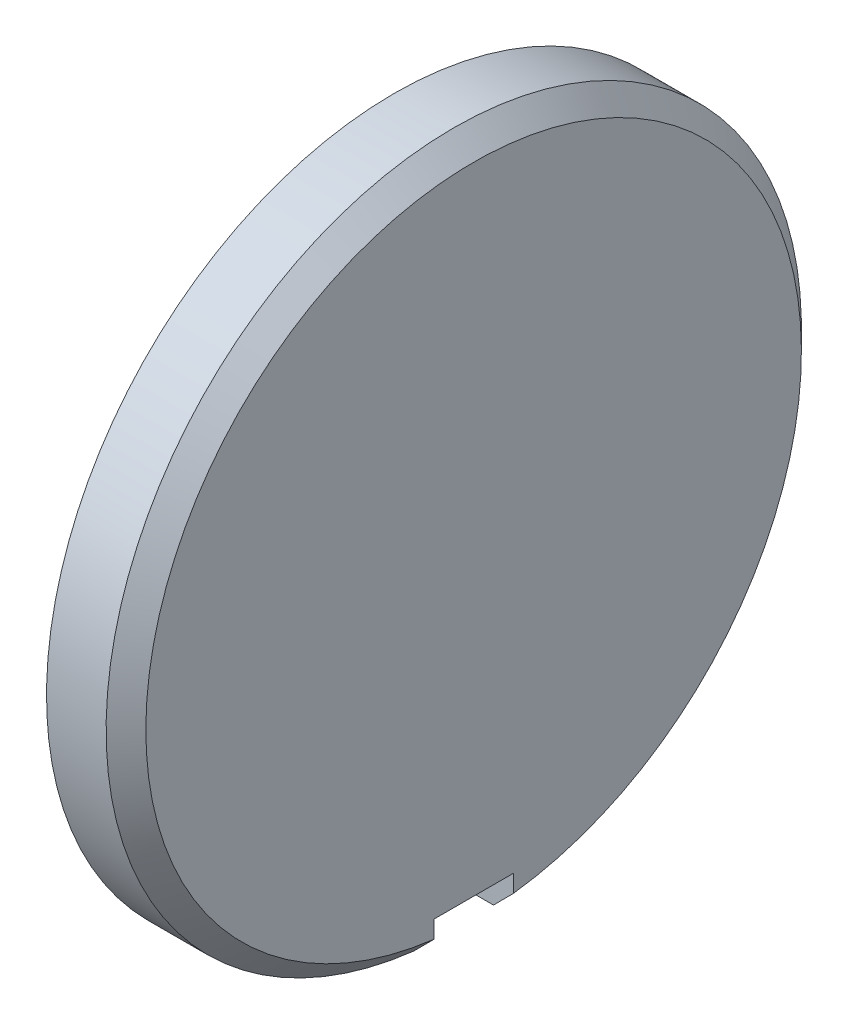
ISO-10303-21;
HEADER;
FILE_DESCRIPTION(('STEP AP214'),'2;1');
FILE_NAME('part.step','',(''),(''),'','','');
FILE_SCHEMA(('AUTOMOTIVE_DESIGN { 1 0 10303 214 1 1 1 1 }'));
ENDSEC;
DATA;
#1=APPLICATION_CONTEXT('core data for automotive mechanical design processes');
#2=APPLICATION_PROTOCOL_DEFINITION('international standard','automotive_design',2000,#1);
#3=PRODUCT_CONTEXT('',#1,'mechanical');
#4=PRODUCT('Part','Part','',(#3));
#5=PRODUCT_RELATED_PRODUCT_CATEGORY('part','',(#4));
#6=PRODUCT_DEFINITION_FORMATION('','',#4);
#7=PRODUCT_DEFINITION_CONTEXT('part definition',#1,'design');
#8=PRODUCT_DEFINITION('design','',#6,#7);
#9=PRODUCT_DEFINITION_SHAPE('','',#8);
#10=(LENGTH_UNIT() NAMED_UNIT(*) SI_UNIT(.MILLI.,.METRE.));
#11=(NAMED_UNIT(*) PLANE_ANGLE_UNIT() SI_UNIT($,.RADIAN.));
#12=(NAMED_UNIT(*) SI_UNIT($,.STERADIAN.) SOLID_ANGLE_UNIT());
#13=UNCERTAINTY_MEASURE_WITH_UNIT(LENGTH_MEASURE(1.E-05),#10,'distance_accuracy_value','');
#14=(GEOMETRIC_REPRESENTATION_CONTEXT(3) GLOBAL_UNCERTAINTY_ASSIGNED_CONTEXT((#13)) GLOBAL_UNIT_ASSIGNED_CONTEXT((#10,
#11,#12)) REPRESENTATION_CONTEXT('',''));
#15=CARTESIAN_POINT('',(0.,0.,0.));
#16=DIRECTION('',(0.,0.,1.));
#17=DIRECTION('',(1.,0.,0.));
#18=AXIS2_PLACEMENT_3D('',#15,#16,#17);
#19=CARTESIAN_POINT('',(85.6,-65.,66.));
#20=DIRECTION('',(-1.,0.,0.));
#21=DIRECTION('',(0.,0.,1.));
#22=AXIS2_PLACEMENT_3D('',#19,#20,#21);
#23=PLANE('',#22);
#24=DIRECTION('',(0.,-1.,0.));
#25=VECTOR('',#24,1.);
#26=CARTESIAN_POINT('',(85.6,-65.,66.8));
#27=LINE('',#26,#25);
#28=CARTESIAN_POINT('',(85.6,-71.2,66.8));
#29=VERTEX_POINT('',#28);
#30=CARTESIAN_POINT('',(85.6,-71.5513357416637,66.8));
#31=VERTEX_POINT('',#30);
#32=EDGE_CURVE('E210',#29,#31,#27,.T.);
#33=ORIENTED_EDGE('',*,*,#32,.F.);
#34=DIRECTION('',(0.,0.,1.));
#35=VECTOR('',#34,1.);
#36=CARTESIAN_POINT('',(85.6,-71.2,66.));
#37=LINE('',#36,#35);
#38=CARTESIAN_POINT('',(85.6,-71.2,65.2));
#39=VERTEX_POINT('',#38);
#40=EDGE_CURVE('E202',#39,#29,#37,.T.);
#41=ORIENTED_EDGE('',*,*,#40,.F.);
#42=DIRECTION('',(0.,-1.,0.));
#43=VECTOR('',#42,1.);
#44=CARTESIAN_POINT('',(85.6,-65.,65.2));
#45=LINE('',#44,#43);
#46=CARTESIAN_POINT('',(85.6,-71.5513357416637,65.2));
#47=VERTEX_POINT('',#46);
#48=EDGE_CURVE('E188',#39,#47,#45,.T.);
#49=ORIENTED_EDGE('',*,*,#48,.T.);
#50=CARTESIAN_POINT('',(85.6,-65.,66.));
#51=DIRECTION('',(-1.,0.,0.));
#52=DIRECTION('',(0.,0.,1.));
#53=AXIS2_PLACEMENT_3D('',#50,#51,#52);
#54=CIRCLE('',#53,6.6);
#55=EDGE_CURVE('E315',#31,#47,#54,.T.);
#56=ORIENTED_EDGE('',*,*,#55,.F.);
#57=EDGE_LOOP('',(#33,#41,#49,#56));
#58=FACE_BOUND('',#57,.T.);
#59=ADVANCED_FACE('F47',(#58),#23,.F.);
#60=CARTESIAN_POINT('',(85.6,-65.,66.));
#61=DIRECTION('',(-1.,0.,0.));
#62=DIRECTION('',(0.,0.,1.));
#63=AXIS2_PLACEMENT_3D('',#60,#61,#62);
#64=CONICAL_SURFACE('',#63,6.6,0.785398163397466);
#65=CARTESIAN_POINT('',(86.4946271909999,-70.6490068941078,66.8));
#66=CARTESIAN_POINT('',(86.3124416781385,-70.8330057927748,66.8));
#67=CARTESIAN_POINT('',(86.1301724326838,-71.0169217300399,66.8));
#68=CARTESIAN_POINT('',(85.7654990840124,-71.3846197394094,66.8));
#69=CARTESIAN_POINT('',(85.5830949808418,-71.5684018115597,66.8));
#70=CARTESIAN_POINT('',(85.2181844268204,-71.9358642466467,66.8));
#71=CARTESIAN_POINT('',(85.0356779759848,-72.1195446095986,66.8));
#72=CARTESIAN_POINT('',(84.6705824210977,-72.4868233002689,66.8));
#73=CARTESIAN_POINT('',(84.4879933170182,-72.6704216279594,66.8));
#74=CARTESIAN_POINT('',(84.3053728090001,-72.8539886990545,66.8));
#75=B_SPLINE_CURVE_WITH_KNOTS('',3,(#65,#66,#67,#68,#69,#70,#71,#72,#73,#74),.UNSPECIFIED.,.F.,
.F.,(4,2,2,2,4),(0.,0.776803884748463,1.55360750407648,2.33041100759796,3.10721477439803),.UNSPECIFIED.);
#76=CARTESIAN_POINT('',(85.2,-71.9541354602855,66.8));
#77=VERTEX_POINT('',#76);
#78=EDGE_CURVE('E217',#31,#77,#75,.T.);
#79=ORIENTED_EDGE('',*,*,#78,.F.);
#80=ORIENTED_EDGE('',*,*,#55,.T.);
#81=CARTESIAN_POINT('',(86.4946271909999,-70.6490068941078,65.2));
#82=CARTESIAN_POINT('',(86.3124416781385,-70.8330057927748,65.2));
#83=CARTESIAN_POINT('',(86.1301724326838,-71.0169217300399,65.2));
#84=CARTESIAN_POINT('',(85.7654990840124,-71.3846197394094,65.2));
#85=CARTESIAN_POINT('',(85.5830949808418,-71.5684018115597,65.2));
#86=CARTESIAN_POINT('',(85.2181844268204,-71.9358642466467,65.2));
#87=CARTESIAN_POINT('',(85.0356779759848,-72.1195446095986,65.2));
#88=CARTESIAN_POINT('',(84.6705824210977,-72.4868233002689,65.2));
#89=CARTESIAN_POINT('',(84.4879933170182,-72.6704216279594,65.2));
#90=CARTESIAN_POINT('',(84.3053728090001,-72.8539886990545,65.2));
#91=B_SPLINE_CURVE_WITH_KNOTS('',3,(#81,#82,#83,#84,#85,#86,#87,#88,#89,#90),.UNSPECIFIED.,.F.,
.F.,(4,2,2,2,4),(0.,0.776803884748463,1.55360750407648,2.33041100759796,3.10721477439803),.UNSPECIFIED.);
#92=CARTESIAN_POINT('',(85.2,-71.9541354602855,65.2));
#93=VERTEX_POINT('',#92);
#94=EDGE_CURVE('E191',#47,#93,#91,.T.);
#95=ORIENTED_EDGE('',*,*,#94,.T.);
#96=CARTESIAN_POINT('',(85.2,-65.,66.));
#97=DIRECTION('',(-1.,0.,0.));
#98=DIRECTION('',(0.,0.,1.));
#99=AXIS2_PLACEMENT_3D('',#96,#97,#98);
#100=CIRCLE('',#99,7.);
#101=EDGE_CURVE('E311',#77,#93,#100,.T.);
#102=ORIENTED_EDGE('',*,*,#101,.F.);
#103=EDGE_LOOP('',(#79,#80,#95,#102));
#104=FACE_BOUND('',#103,.T.);
#105=ADVANCED_FACE('F470',(#104),#64,.T.);
#106=CARTESIAN_POINT('',(77.8,-65.,66.));
#107=DIRECTION('',(-1.,0.,0.));
#108=DIRECTION('',(0.,0.,1.));
#109=AXIS2_PLACEMENT_3D('',#106,#107,#108);
#110=CYLINDRICAL_SURFACE('',#109,7.);
#111=DIRECTION('',(-1.,0.,0.));
#112=VECTOR('',#111,1.);
#113=CARTESIAN_POINT('',(77.8,-71.9541354602855,66.8));
#114=LINE('',#113,#112);
#115=CARTESIAN_POINT('',(84.,-71.9541354602855,66.8));
#116=VERTEX_POINT('',#115);
#117=EDGE_CURVE('E197',#77,#116,#114,.T.);
#118=ORIENTED_EDGE('',*,*,#117,.F.);
#119=ORIENTED_EDGE('',*,*,#101,.T.);
#120=DIRECTION('',(-1.,0.,0.));
#121=VECTOR('',#120,1.);
#122=CARTESIAN_POINT('',(77.8,-71.9541354602855,65.2));
#123=LINE('',#122,#121);
#124=CARTESIAN_POINT('',(84.,-71.9541354602855,65.2));
#125=VERTEX_POINT('',#124);
#126=EDGE_CURVE('E679',#93,#125,#123,.T.);
#127=ORIENTED_EDGE('',*,*,#126,.T.);
#128=CARTESIAN_POINT('',(84.,-65.,66.));
#129=DIRECTION('',(-1.,0.,0.));
#130=DIRECTION('',(0.,0.,1.));
#131=AXIS2_PLACEMENT_3D('',#128,#129,#130);
#132=CIRCLE('',#131,7.);
#133=EDGE_CURVE('E307',#116,#125,#132,.T.);
#134=ORIENTED_EDGE('',*,*,#133,.F.);
#135=EDGE_LOOP('',(#118,#119,#127,#134));
#136=FACE_BOUND('',#135,.T.);
#137=ADVANCED_FACE('F475',(#136),#110,.T.);
#138=CARTESIAN_POINT('',(84.,-58.,66.));
#139=DIRECTION('',(1.,0.,0.));
#140=DIRECTION('',(0.,0.,-1.));
#141=AXIS2_PLACEMENT_3D('',#138,#139,#140);
#142=PLANE('',#141);
#143=CARTESIAN_POINT('',(84.,-65.,66.));
#144=DIRECTION('',(-1.,0.,0.));
#145=DIRECTION('',(0.,0.,1.));
#146=AXIS2_PLACEMENT_3D('',#143,#144,#145);
#147=CIRCLE('',#146,3.);
#148=CARTESIAN_POINT('',(84.,-65.,69.));
#149=VERTEX_POINT('',#148);
#150=EDGE_CURVE('E301',#149,#149,#147,.T.);
#151=ORIENTED_EDGE('',*,*,#150,.F.);
#152=EDGE_LOOP('',(#151));
#153=FACE_BOUND('',#152,.T.);
#154=DIRECTION('',(0.,1.,0.));
#155=VECTOR('',#154,1.);
#156=CARTESIAN_POINT('',(84.,-58.,66.8));
#157=LINE('',#156,#155);
#158=CARTESIAN_POINT('',(84.,-71.2,66.8));
#159=VERTEX_POINT('',#158);
#160=EDGE_CURVE('E11',#116,#159,#157,.T.);
#161=ORIENTED_EDGE('',*,*,#160,.F.);
#162=ORIENTED_EDGE('',*,*,#133,.T.);
#163=DIRECTION('',(0.,1.,0.));
#164=VECTOR('',#163,1.);
#165=CARTESIAN_POINT('',(84.,-58.,65.2));
#166=LINE('',#165,#164);
#167=CARTESIAN_POINT('',(84.,-71.2,65.2));
#168=VERTEX_POINT('',#167);
#169=EDGE_CURVE('E363',#125,#168,#166,.T.);
#170=ORIENTED_EDGE('',*,*,#169,.T.);
#171=DIRECTION('',(0.,0.,-1.));
#172=VECTOR('',#171,1.);
#173=CARTESIAN_POINT('',(84.,-71.2,66.));
#174=LINE('',#173,#172);
#175=EDGE_CURVE('E56',#159,#168,#174,.T.);
#176=ORIENTED_EDGE('',*,*,#175,.F.);
#177=EDGE_LOOP('',(#161,#162,#170,#176));
#178=FACE_BOUND('',#177,.T.);
#179=ADVANCED_FACE('F498',(#153,#178),#142,.F.);
#180=CARTESIAN_POINT('',(82.8,-62.,66.));
#181=DIRECTION('',(1.,0.,0.));
#182=DIRECTION('',(0.,0.,-1.));
#183=AXIS2_PLACEMENT_3D('',#180,#181,#182);
#184=PLANE('',#183);
#185=DIRECTION('',(0.,1.,0.));
#186=VECTOR('',#185,1.);
#187=CARTESIAN_POINT('',(82.8,-62.,66.4));
#188=LINE('',#187,#186);
#189=CARTESIAN_POINT('',(82.8,-67.9732137494637,66.4));
#190=VERTEX_POINT('',#189);
#191=CARTESIAN_POINT('',(82.8,-67.2649503305812,66.4));
#192=VERTEX_POINT('',#191);
#193=EDGE_CURVE('E248',#190,#192,#188,.T.);
#194=ORIENTED_EDGE('',*,*,#193,.F.);
#195=CARTESIAN_POINT('',(82.8,-65.,66.));
#196=DIRECTION('',(-1.,0.,0.));
#197=DIRECTION('',(0.,0.,1.));
#198=AXIS2_PLACEMENT_3D('',#195,#196,#197);
#199=CIRCLE('',#198,3.);
#200=CARTESIAN_POINT('',(82.8,-65.4,68.9732137494637));
#201=VERTEX_POINT('',#200);
#202=EDGE_CURVE('E296',#190,#201,#199,.T.);
#203=ORIENTED_EDGE('',*,*,#202,.T.);
#204=DIRECTION('',(0.,0.,1.));
#205=VECTOR('',#204,1.);
#206=CARTESIAN_POINT('',(82.8,-65.4,66.));
#207=LINE('',#206,#205);
#208=CARTESIAN_POINT('',(82.8,-65.4,68.2649503305812));
#209=VERTEX_POINT('',#208);
#210=EDGE_CURVE('E284',#209,#201,#207,.T.);
#211=ORIENTED_EDGE('',*,*,#210,.F.);
#212=CARTESIAN_POINT('',(82.8,-65.,66.));
#213=DIRECTION('',(-1.,0.,0.));
#214=DIRECTION('',(0.,0.,1.));
#215=AXIS2_PLACEMENT_3D('',#212,#213,#214);
#216=CIRCLE('',#215,2.3);
#217=EDGE_CURVE('E322',#192,#209,#216,.T.);
#218=ORIENTED_EDGE('',*,*,#217,.F.);
#219=EDGE_LOOP('',(#194,#203,#211,#218));
#220=FACE_BOUND('',#219,.T.);
#221=ADVANCED_FACE('F418',(#220),#184,.F.);
#222=DIRECTION('',(0.,1.,0.));
#223=VECTOR('',#222,1.);
#224=CARTESIAN_POINT('',(82.8,-62.,66.4));
#225=LINE('',#224,#223);
#226=CARTESIAN_POINT('',(82.8,-62.7350496694188,66.4));
#227=VERTEX_POINT('',#226);
#228=CARTESIAN_POINT('',(82.8,-62.0267862505363,66.4));
#229=VERTEX_POINT('',#228);
#230=EDGE_CURVE('E242',#227,#229,#225,.T.);
#231=ORIENTED_EDGE('',*,*,#230,.F.);
#232=CARTESIAN_POINT('',(82.8,-64.6,68.2649503305812));
#233=VERTEX_POINT('',#232);
#234=EDGE_CURVE('E323',#233,#227,#216,.T.);
#235=ORIENTED_EDGE('',*,*,#234,.F.);
#236=DIRECTION('',(0.,0.,-1.));
#237=VECTOR('',#236,1.);
#238=CARTESIAN_POINT('',(82.8,-64.6,66.));
#239=LINE('',#238,#237);
#240=CARTESIAN_POINT('',(82.8,-64.6,68.9732137494637));
#241=VERTEX_POINT('',#240);
#242=EDGE_CURVE('E273',#241,#233,#239,.T.);
#243=ORIENTED_EDGE('',*,*,#242,.F.);
#244=EDGE_CURVE('E297',#241,#229,#199,.T.);
#245=ORIENTED_EDGE('',*,*,#244,.T.);
#246=EDGE_LOOP('',(#231,#235,#243,#245));
#247=FACE_BOUND('',#246,.T.);
#248=ADVANCED_FACE('F436',(#247),#184,.F.);
#249=CARTESIAN_POINT('',(77.8,-65.,66.));
#250=DIRECTION('',(-1.,0.,0.));
#251=DIRECTION('',(0.,0.,1.));
#252=AXIS2_PLACEMENT_3D('',#249,#250,#251);
#253=CYLINDRICAL_SURFACE('',#252,2.3);
#254=CARTESIAN_POINT('',(84.,-65.,66.));
#255=DIRECTION('',(-1.,0.,0.));
#256=DIRECTION('',(0.,0.,1.));
#257=AXIS2_PLACEMENT_3D('',#254,#255,#256);
#258=CIRCLE('',#257,2.3);
#259=CARTESIAN_POINT('',(84.,-65.,68.3));
#260=VERTEX_POINT('',#259);
#261=EDGE_CURVE('E318',#260,#260,#258,.T.);
#262=ORIENTED_EDGE('',*,*,#261,.F.);
#263=EDGE_LOOP('',(#262));
#264=FACE_BOUND('',#263,.T.);
#265=DIRECTION('',(-1.,0.,0.));
#266=VECTOR('',#265,1.);
#267=CARTESIAN_POINT('',(77.8,-67.2649503305812,66.4));
#268=LINE('',#267,#266);
#269=CARTESIAN_POINT('',(83.98,-67.2649503305812,66.4));
#270=VERTEX_POINT('',#269);
#271=EDGE_CURVE('E251',#192,#270,#268,.F.);
#272=ORIENTED_EDGE('',*,*,#271,.F.);
#273=ORIENTED_EDGE('',*,*,#217,.T.);
#274=DIRECTION('',(-1.,0.,0.));
#275=VECTOR('',#274,1.);
#276=CARTESIAN_POINT('',(77.8,-65.4,68.2649503305812));
#277=LINE('',#276,#275);
#278=CARTESIAN_POINT('',(83.98,-65.4,68.2649503305812));
#279=VERTEX_POINT('',#278);
#280=EDGE_CURVE('E288',#279,#209,#277,.T.);
#281=ORIENTED_EDGE('',*,*,#280,.F.);
#282=CARTESIAN_POINT('',(83.98,-65.,66.));
#283=DIRECTION('',(-1.,0.,0.));
#284=DIRECTION('',(0.,0.,1.));
#285=AXIS2_PLACEMENT_3D('',#282,#283,#284);
#286=CIRCLE('',#285,2.3);
#287=CARTESIAN_POINT('',(83.98,-64.6,68.2649503305812));
#288=VERTEX_POINT('',#287);
#289=EDGE_CURVE('E280',#288,#279,#286,.F.);
#290=ORIENTED_EDGE('',*,*,#289,.F.);
#291=DIRECTION('',(-1.,0.,0.));
#292=VECTOR('',#291,1.);
#293=CARTESIAN_POINT('',(77.8,-64.6,68.2649503305812));
#294=LINE('',#293,#292);
#295=EDGE_CURVE('E277',#233,#288,#294,.F.);
#296=ORIENTED_EDGE('',*,*,#295,.F.);
#297=ORIENTED_EDGE('',*,*,#234,.T.);
#298=DIRECTION('',(-1.,0.,0.));
#299=VECTOR('',#298,1.);
#300=CARTESIAN_POINT('',(77.8,-62.7350496694188,66.4));
#301=LINE('',#300,#299);
#302=CARTESIAN_POINT('',(83.98,-62.7350496694188,66.4));
#303=VERTEX_POINT('',#302);
#304=EDGE_CURVE('E245',#303,#227,#301,.T.);
#305=ORIENTED_EDGE('',*,*,#304,.F.);
#306=CARTESIAN_POINT('',(83.98,-65.,66.));
#307=DIRECTION('',(-1.,0.,0.));
#308=DIRECTION('',(0.,0.,1.));
#309=AXIS2_PLACEMENT_3D('',#306,#307,#308);
#310=CIRCLE('',#309,2.3);
#311=CARTESIAN_POINT('',(83.98,-62.7350496694188,65.6));
#312=VERTEX_POINT('',#311);
#313=EDGE_CURVE('E254',#312,#303,#310,.F.);
#314=ORIENTED_EDGE('',*,*,#313,.F.);
#315=DIRECTION('',(-1.,0.,0.));
#316=VECTOR('',#315,1.);
#317=CARTESIAN_POINT('',(77.8,-62.7350496694188,65.6));
#318=LINE('',#317,#316);
#319=CARTESIAN_POINT('',(82.8,-62.7350496694188,65.6));
#320=VERTEX_POINT('',#319);
#321=EDGE_CURVE('E230',#312,#320,#318,.T.);
#322=ORIENTED_EDGE('',*,*,#321,.T.);
#323=CARTESIAN_POINT('',(82.8,-64.6,63.7350496694188));
#324=VERTEX_POINT('',#323);
#325=EDGE_CURVE('E328',#320,#324,#216,.T.);
#326=ORIENTED_EDGE('',*,*,#325,.T.);
#327=DIRECTION('',(-1.,0.,0.));
#328=VECTOR('',#327,1.);
#329=CARTESIAN_POINT('',(77.8,-64.6,63.7350496694188));
#330=LINE('',#329,#328);
#331=CARTESIAN_POINT('',(83.98,-64.6,63.7350496694188));
#332=VERTEX_POINT('',#331);
#333=EDGE_CURVE('E272',#332,#324,#330,.T.);
#334=ORIENTED_EDGE('',*,*,#333,.F.);
#335=CARTESIAN_POINT('',(83.98,-65.4,63.7350496694188));
#336=VERTEX_POINT('',#335);
#337=EDGE_CURVE('E283',#336,#332,#286,.F.);
#338=ORIENTED_EDGE('',*,*,#337,.F.);
#339=DIRECTION('',(-1.,0.,0.));
#340=VECTOR('',#339,1.);
#341=CARTESIAN_POINT('',(77.8,-65.4,63.7350496694188));
#342=LINE('',#341,#340);
#343=CARTESIAN_POINT('',(82.8,-65.4,63.7350496694188));
#344=VERTEX_POINT('',#343);
#345=EDGE_CURVE('E293',#344,#336,#342,.F.);
#346=ORIENTED_EDGE('',*,*,#345,.F.);
#347=CARTESIAN_POINT('',(82.8,-67.2649503305812,65.6));
#348=VERTEX_POINT('',#347);
#349=EDGE_CURVE('E329',#344,#348,#216,.T.);
#350=ORIENTED_EDGE('',*,*,#349,.T.);
#351=DIRECTION('',(-1.,0.,0.));
#352=VECTOR('',#351,1.);
#353=CARTESIAN_POINT('',(77.8,-67.2649503305812,65.6));
#354=LINE('',#353,#352);
#355=CARTESIAN_POINT('',(83.98,-67.2649503305812,65.6));
#356=VERTEX_POINT('',#355);
#357=EDGE_CURVE('E238',#348,#356,#354,.F.);
#358=ORIENTED_EDGE('',*,*,#357,.T.);
#359=EDGE_CURVE('E257',#270,#356,#310,.F.);
#360=ORIENTED_EDGE('',*,*,#359,.F.);
#361=EDGE_LOOP('',(#272,#273,#281,#290,#296,#297,#305,#314,#322,#326,#334,#338,#346,#350,#358,#360));
#362=FACE_BOUND('',#361,.T.);
#363=ADVANCED_FACE('F397',(#264,#362),#253,.F.);
#364=CARTESIAN_POINT('',(77.8,-65.,66.));
#365=DIRECTION('',(-1.,0.,0.));
#366=DIRECTION('',(0.,0.,1.));
#367=AXIS2_PLACEMENT_3D('',#364,#365,#366);
#368=CYLINDRICAL_SURFACE('',#367,3.);
#369=ORIENTED_EDGE('',*,*,#150,.T.);
#370=EDGE_LOOP('',(#369));
#371=FACE_BOUND('',#370,.T.);
#372=DIRECTION('',(-1.,0.,0.));
#373=VECTOR('',#372,1.);
#374=CARTESIAN_POINT('',(77.8,-67.9732137494637,66.4));
#375=LINE('',#374,#373);
#376=CARTESIAN_POINT('',(83.98,-67.9732137494637,66.4));
#377=VERTEX_POINT('',#376);
#378=EDGE_CURVE('E360',#377,#190,#375,.T.);
#379=ORIENTED_EDGE('',*,*,#378,.F.);
#380=CARTESIAN_POINT('',(83.98,-65.,66.));
#381=DIRECTION('',(-1.,0.,0.));
#382=DIRECTION('',(0.,0.,1.));
#383=AXIS2_PLACEMENT_3D('',#380,#381,#382);
#384=CIRCLE('',#383,3.);
#385=CARTESIAN_POINT('',(83.98,-67.9732137494637,65.6));
#386=VERTEX_POINT('',#385);
#387=EDGE_CURVE('E353',#386,#377,#384,.T.);
#388=ORIENTED_EDGE('',*,*,#387,.F.);
#389=DIRECTION('',(-1.,0.,0.));
#390=VECTOR('',#389,1.);
#391=CARTESIAN_POINT('',(77.8,-67.9732137494637,65.6));
#392=LINE('',#391,#390);
#393=CARTESIAN_POINT('',(82.8,-67.9732137494637,65.6));
#394=VERTEX_POINT('',#393);
#395=EDGE_CURVE('E356',#386,#394,#392,.T.);
#396=ORIENTED_EDGE('',*,*,#395,.T.);
#397=CARTESIAN_POINT('',(82.8,-65.4,63.0267862505363));
#398=VERTEX_POINT('',#397);
#399=EDGE_CURVE('E303',#398,#394,#199,.T.);
#400=ORIENTED_EDGE('',*,*,#399,.F.);
#401=DIRECTION('',(-1.,0.,0.));
#402=VECTOR('',#401,1.);
#403=CARTESIAN_POINT('',(77.8,-65.4,63.0267862505363));
#404=LINE('',#403,#402);
#405=CARTESIAN_POINT('',(83.98,-65.4,63.0267862505363));
#406=VERTEX_POINT('',#405);
#407=EDGE_CURVE('E335',#406,#398,#404,.T.);
#408=ORIENTED_EDGE('',*,*,#407,.F.);
#409=CARTESIAN_POINT('',(83.98,-65.,66.));
#410=DIRECTION('',(-1.,0.,0.));
#411=DIRECTION('',(0.,0.,1.));
#412=AXIS2_PLACEMENT_3D('',#409,#410,#411);
#413=CIRCLE('',#412,3.);
#414=CARTESIAN_POINT('',(83.98,-64.6,63.0267862505363));
#415=VERTEX_POINT('',#414);
#416=EDGE_CURVE('E332',#415,#406,#413,.T.);
#417=ORIENTED_EDGE('',*,*,#416,.F.);
#418=DIRECTION('',(-1.,0.,0.));
#419=VECTOR('',#418,1.);
#420=CARTESIAN_POINT('',(77.8,-64.6,63.0267862505363));
#421=LINE('',#420,#419);
#422=CARTESIAN_POINT('',(82.8,-64.6,63.0267862505363));
#423=VERTEX_POINT('',#422);
#424=EDGE_CURVE('E327',#423,#415,#421,.F.);
#425=ORIENTED_EDGE('',*,*,#424,.F.);
#426=CARTESIAN_POINT('',(82.8,-62.0267862505363,65.6));
#427=VERTEX_POINT('',#426);
#428=EDGE_CURVE('E302',#427,#423,#199,.T.);
#429=ORIENTED_EDGE('',*,*,#428,.F.);
#430=DIRECTION('',(-1.,0.,0.));
#431=VECTOR('',#430,1.);
#432=CARTESIAN_POINT('',(77.8,-62.0267862505363,65.6));
#433=LINE('',#432,#431);
#434=CARTESIAN_POINT('',(83.98,-62.0267862505363,65.6));
#435=VERTEX_POINT('',#434);
#436=EDGE_CURVE('E345',#427,#435,#433,.F.);
#437=ORIENTED_EDGE('',*,*,#436,.T.);
#438=CARTESIAN_POINT('',(83.98,-62.0267862505363,66.4));
#439=VERTEX_POINT('',#438);
#440=EDGE_CURVE('E349',#439,#435,#384,.T.);
#441=ORIENTED_EDGE('',*,*,#440,.F.);
#442=DIRECTION('',(-1.,0.,0.));
#443=VECTOR('',#442,1.);
#444=CARTESIAN_POINT('',(77.8,-62.0267862505363,66.4));
#445=LINE('',#444,#443);
#446=EDGE_CURVE('E352',#229,#439,#445,.F.);
#447=ORIENTED_EDGE('',*,*,#446,.F.);
#448=ORIENTED_EDGE('',*,*,#244,.F.);
#449=DIRECTION('',(-1.,0.,0.));
#450=VECTOR('',#449,1.);
#451=CARTESIAN_POINT('',(77.8,-64.6,68.9732137494637));
#452=LINE('',#451,#450);
#453=CARTESIAN_POINT('',(83.98,-64.6,68.9732137494637));
#454=VERTEX_POINT('',#453);
#455=EDGE_CURVE('E339',#454,#241,#452,.T.);
#456=ORIENTED_EDGE('',*,*,#455,.F.);
#457=CARTESIAN_POINT('',(83.98,-65.4,68.9732137494637));
#458=VERTEX_POINT('',#457);
#459=EDGE_CURVE('E336',#458,#454,#413,.T.);
#460=ORIENTED_EDGE('',*,*,#459,.F.);
#461=DIRECTION('',(-1.,0.,0.));
#462=VECTOR('',#461,1.);
#463=CARTESIAN_POINT('',(77.8,-65.4,68.9732137494637));
#464=LINE('',#463,#462);
#465=EDGE_CURVE('E342',#201,#458,#464,.F.);
#466=ORIENTED_EDGE('',*,*,#465,.F.);
#467=ORIENTED_EDGE('',*,*,#202,.F.);
#468=EDGE_LOOP('',(#379,#388,#396,#400,#408,#417,#425,#429,#437,#441,#447,#448,#456,#460,#466,#467));
#469=FACE_BOUND('',#468,.T.);
#470=ADVANCED_FACE('F406',(#371,#469),#368,.T.);
#471=ORIENTED_EDGE('',*,*,#399,.T.);
#472=DIRECTION('',(0.,1.,0.));
#473=VECTOR('',#472,1.);
#474=CARTESIAN_POINT('',(82.8,-62.,65.6));
#475=LINE('',#474,#473);
#476=EDGE_CURVE('E234',#394,#348,#475,.T.);
#477=ORIENTED_EDGE('',*,*,#476,.T.);
#478=ORIENTED_EDGE('',*,*,#349,.F.);
#479=EDGE_CURVE('E289',#398,#344,#207,.T.);
#480=ORIENTED_EDGE('',*,*,#479,.F.);
#481=EDGE_LOOP('',(#471,#477,#478,#480));
#482=FACE_BOUND('',#481,.T.);
#483=ADVANCED_FACE('F49',(#482),#184,.F.);
#484=ORIENTED_EDGE('',*,*,#325,.F.);
#485=DIRECTION('',(0.,1.,0.));
#486=VECTOR('',#485,1.);
#487=CARTESIAN_POINT('',(82.8,-62.,65.6));
#488=LINE('',#487,#486);
#489=EDGE_CURVE('E226',#320,#427,#488,.T.);
#490=ORIENTED_EDGE('',*,*,#489,.T.);
#491=ORIENTED_EDGE('',*,*,#428,.T.);
#492=EDGE_CURVE('E268',#324,#423,#239,.T.);
#493=ORIENTED_EDGE('',*,*,#492,.F.);
#494=EDGE_LOOP('',(#484,#490,#491,#493));
#495=FACE_BOUND('',#494,.T.);
#496=ADVANCED_FACE('F450',(#495),#184,.F.);
#497=CARTESIAN_POINT('',(84.,-62.7,66.));
#498=DIRECTION('',(1.,0.,0.));
#499=DIRECTION('',(0.,0.,-1.));
#500=AXIS2_PLACEMENT_3D('',#497,#498,#499);
#501=PLANE('',#500);
#502=ORIENTED_EDGE('',*,*,#261,.T.);
#503=EDGE_LOOP('',(#502));
#504=FACE_BOUND('',#503,.T.);
#505=ADVANCED_FACE('F481',(#504),#501,.F.);
#506=CARTESIAN_POINT('',(82.7,-64.6,69.2));
#507=DIRECTION('',(0.,-1.,0.));
#508=DIRECTION('',(0.,0.,-1.));
#509=AXIS2_PLACEMENT_3D('',#506,#507,#508);
#510=PLANE('',#509);
#511=ORIENTED_EDGE('',*,*,#333,.T.);
#512=ORIENTED_EDGE('',*,*,#492,.T.);
#513=ORIENTED_EDGE('',*,*,#424,.T.);
#514=DIRECTION('',(0.,0.,-1.));
#515=VECTOR('',#514,1.);
#516=CARTESIAN_POINT('',(83.98,-64.6,69.2));
#517=LINE('',#516,#515);
#518=EDGE_CURVE('E258',#332,#415,#517,.T.);
#519=ORIENTED_EDGE('',*,*,#518,.F.);
#520=EDGE_LOOP('',(#511,#512,#513,#519));
#521=FACE_BOUND('',#520,.T.);
#522=ADVANCED_FACE('F453',(#521),#510,.T.);
#523=CARTESIAN_POINT('',(83.98,-65.4,69.2));
#524=DIRECTION('',(-1.,0.,0.));
#525=DIRECTION('',(0.,0.,1.));
#526=AXIS2_PLACEMENT_3D('',#523,#524,#525);
#527=PLANE('',#526);
#528=ORIENTED_EDGE('',*,*,#337,.T.);
#529=ORIENTED_EDGE('',*,*,#518,.T.);
#530=ORIENTED_EDGE('',*,*,#416,.T.);
#531=DIRECTION('',(0.,0.,-1.));
#532=VECTOR('',#531,1.);
#533=CARTESIAN_POINT('',(83.98,-65.4,69.2));
#534=LINE('',#533,#532);
#535=EDGE_CURVE('E263',#336,#406,#534,.T.);
#536=ORIENTED_EDGE('',*,*,#535,.F.);
#537=EDGE_LOOP('',(#528,#529,#530,#536));
#538=FACE_BOUND('',#537,.T.);
#539=ADVANCED_FACE('F458',(#538),#527,.T.);
#540=CARTESIAN_POINT('',(82.7,-65.4,69.2));
#541=DIRECTION('',(0.,1.,0.));
#542=DIRECTION('',(0.,0.,1.));
#543=AXIS2_PLACEMENT_3D('',#540,#541,#542);
#544=PLANE('',#543);
#545=ORIENTED_EDGE('',*,*,#345,.T.);
#546=ORIENTED_EDGE('',*,*,#535,.T.);
#547=ORIENTED_EDGE('',*,*,#407,.T.);
#548=ORIENTED_EDGE('',*,*,#479,.T.);
#549=EDGE_LOOP('',(#545,#546,#547,#548));
#550=FACE_BOUND('',#549,.T.);
#551=ADVANCED_FACE('F460',(#550),#544,.T.);
#552=ORIENTED_EDGE('',*,*,#280,.T.);
#553=ORIENTED_EDGE('',*,*,#210,.T.);
#554=ORIENTED_EDGE('',*,*,#465,.T.);
#555=EDGE_CURVE('E267',#458,#279,#534,.T.);
#556=ORIENTED_EDGE('',*,*,#555,.T.);
#557=EDGE_LOOP('',(#552,#553,#554,#556));
#558=FACE_BOUND('',#557,.T.);
#559=ADVANCED_FACE('F421',(#558),#544,.T.);
#560=ORIENTED_EDGE('',*,*,#289,.T.);
#561=ORIENTED_EDGE('',*,*,#555,.F.);
#562=ORIENTED_EDGE('',*,*,#459,.T.);
#563=EDGE_CURVE('E262',#454,#288,#517,.T.);
#564=ORIENTED_EDGE('',*,*,#563,.T.);
#565=EDGE_LOOP('',(#560,#561,#562,#564));
#566=FACE_BOUND('',#565,.T.);
#567=ADVANCED_FACE('F427',(#566),#527,.T.);
#568=ORIENTED_EDGE('',*,*,#295,.T.);
#569=ORIENTED_EDGE('',*,*,#563,.F.);
#570=ORIENTED_EDGE('',*,*,#455,.T.);
#571=ORIENTED_EDGE('',*,*,#242,.T.);
#572=EDGE_LOOP('',(#568,#569,#570,#571));
#573=FACE_BOUND('',#572,.T.);
#574=ADVANCED_FACE('F539',(#573),#510,.T.);
#575=CARTESIAN_POINT('',(0.,0.,66.4));
#576=DIRECTION('',(0.,0.,-1.));
#577=DIRECTION('',(-1.,0.,0.));
#578=AXIS2_PLACEMENT_3D('',#575,#576,#577);
#579=PLANE('',#578);
#580=ORIENTED_EDGE('',*,*,#304,.T.);
#581=ORIENTED_EDGE('',*,*,#230,.T.);
#582=ORIENTED_EDGE('',*,*,#446,.T.);
#583=DIRECTION('',(0.,1.,0.));
#584=VECTOR('',#583,1.);
#585=CARTESIAN_POINT('',(83.98,-68.2,66.4));
#586=LINE('',#585,#584);
#587=EDGE_CURVE('E221',#303,#439,#586,.T.);
#588=ORIENTED_EDGE('',*,*,#587,.F.);
#589=EDGE_LOOP('',(#580,#581,#582,#588));
#590=FACE_BOUND('',#589,.T.);
#591=ADVANCED_FACE('F439',(#590),#579,.T.);
#592=CARTESIAN_POINT('',(0.,0.,65.6));
#593=DIRECTION('',(0.,0.,-1.));
#594=DIRECTION('',(-1.,0.,0.));
#595=AXIS2_PLACEMENT_3D('',#592,#593,#594);
#596=PLANE('',#595);
#597=DIRECTION('',(0.,1.,0.));
#598=VECTOR('',#597,1.);
#599=CARTESIAN_POINT('',(83.98,-68.2,65.6));
#600=LINE('',#599,#598);
#601=EDGE_CURVE('E71',#312,#435,#600,.T.);
#602=ORIENTED_EDGE('',*,*,#601,.T.);
#603=ORIENTED_EDGE('',*,*,#436,.F.);
#604=ORIENTED_EDGE('',*,*,#489,.F.);
#605=ORIENTED_EDGE('',*,*,#321,.F.);
#606=EDGE_LOOP('',(#602,#603,#604,#605));
#607=FACE_BOUND('',#606,.T.);
#608=ADVANCED_FACE('F564',(#607),#596,.F.);
#609=CARTESIAN_POINT('',(83.98,-68.2,66.4));
#610=DIRECTION('',(-1.,0.,0.));
#611=DIRECTION('',(0.,0.,1.));
#612=AXIS2_PLACEMENT_3D('',#609,#610,#611);
#613=PLANE('',#612);
#614=ORIENTED_EDGE('',*,*,#313,.T.);
#615=ORIENTED_EDGE('',*,*,#587,.T.);
#616=ORIENTED_EDGE('',*,*,#440,.T.);
#617=ORIENTED_EDGE('',*,*,#601,.F.);
#618=EDGE_LOOP('',(#614,#615,#616,#617));
#619=FACE_BOUND('',#618,.T.);
#620=ADVANCED_FACE('F444',(#619),#613,.T.);
#621=ORIENTED_EDGE('',*,*,#359,.T.);
#622=EDGE_CURVE('E215',#386,#356,#600,.T.);
#623=ORIENTED_EDGE('',*,*,#622,.F.);
#624=ORIENTED_EDGE('',*,*,#387,.T.);
#625=EDGE_CURVE('E224',#377,#270,#586,.T.);
#626=ORIENTED_EDGE('',*,*,#625,.T.);
#627=EDGE_LOOP('',(#621,#623,#624,#626));
#628=FACE_BOUND('',#627,.T.);
#629=ADVANCED_FACE('F410',(#628),#613,.T.);
#630=ORIENTED_EDGE('',*,*,#271,.T.);
#631=ORIENTED_EDGE('',*,*,#625,.F.);
#632=ORIENTED_EDGE('',*,*,#378,.T.);
#633=ORIENTED_EDGE('',*,*,#193,.T.);
#634=EDGE_LOOP('',(#630,#631,#632,#633));
#635=FACE_BOUND('',#634,.T.);
#636=ADVANCED_FACE('F412',(#635),#579,.T.);
#637=ORIENTED_EDGE('',*,*,#476,.F.);
#638=ORIENTED_EDGE('',*,*,#395,.F.);
#639=ORIENTED_EDGE('',*,*,#622,.T.);
#640=ORIENTED_EDGE('',*,*,#357,.F.);
#641=EDGE_LOOP('',(#637,#638,#639,#640));
#642=FACE_BOUND('',#641,.T.);
#643=ADVANCED_FACE('F391',(#642),#596,.F.);
#644=CARTESIAN_POINT('',(83.9,-71.2,66.8));
#645=DIRECTION('',(0.,-1.,0.));
#646=DIRECTION('',(0.,0.,-1.));
#647=AXIS2_PLACEMENT_3D('',#644,#645,#646);
#648=PLANE('',#647);
#649=ORIENTED_EDGE('',*,*,#40,.T.);
#650=DIRECTION('',(-1.,0.,0.));
#651=VECTOR('',#650,1.);
#652=CARTESIAN_POINT('',(83.9,-71.2,66.8));
#653=LINE('',#652,#651);
#654=EDGE_CURVE('E207',#29,#159,#653,.T.);
#655=ORIENTED_EDGE('',*,*,#654,.T.);
#656=ORIENTED_EDGE('',*,*,#175,.T.);
#657=DIRECTION('',(-1.,0.,0.));
#658=VECTOR('',#657,1.);
#659=CARTESIAN_POINT('',(83.9,-71.2,65.2));
#660=LINE('',#659,#658);
#661=EDGE_CURVE('E63',#39,#168,#660,.T.);
#662=ORIENTED_EDGE('',*,*,#661,.F.);
#663=EDGE_LOOP('',(#649,#655,#656,#662));
#664=FACE_BOUND('',#663,.T.);
#665=ADVANCED_FACE('F200',(#664),#648,.T.);
#666=CARTESIAN_POINT('',(0.,0.,66.8));
#667=DIRECTION('',(0.,0.,-1.));
#668=DIRECTION('',(-1.,0.,0.));
#669=AXIS2_PLACEMENT_3D('',#666,#667,#668);
#670=PLANE('',#669);
#671=ORIENTED_EDGE('',*,*,#32,.T.);
#672=ORIENTED_EDGE('',*,*,#78,.T.);
#673=ORIENTED_EDGE('',*,*,#117,.T.);
#674=ORIENTED_EDGE('',*,*,#160,.T.);
#675=ORIENTED_EDGE('',*,*,#654,.F.);
#676=EDGE_LOOP('',(#671,#672,#673,#674,#675));
#677=FACE_BOUND('',#676,.T.);
#678=ADVANCED_FACE('F648',(#677),#670,.T.);
#679=CARTESIAN_POINT('',(0.,0.,65.2));
#680=DIRECTION('',(0.,0.,-1.));
#681=DIRECTION('',(-1.,0.,0.));
#682=AXIS2_PLACEMENT_3D('',#679,#680,#681);
#683=PLANE('',#682);
#684=ORIENTED_EDGE('',*,*,#661,.T.);
#685=ORIENTED_EDGE('',*,*,#169,.F.);
#686=ORIENTED_EDGE('',*,*,#126,.F.);
#687=ORIENTED_EDGE('',*,*,#94,.F.);
#688=ORIENTED_EDGE('',*,*,#48,.F.);
#689=EDGE_LOOP('',(#684,#685,#686,#687,#688));
#690=FACE_BOUND('',#689,.T.);
#691=ADVANCED_FACE('F189',(#690),#683,.F.);
#692=CLOSED_SHELL('',(#59,#105,#137,#179,#221,#248,#363,#470,#483,#496,#505,#522,#539,#551,#559,
#567,#574,#591,#608,#620,#629,#636,#643,#665,#678,#691));
#693=MANIFOLD_SOLID_BREP('B2',#692);
#694=ADVANCED_BREP_SHAPE_REPRESENTATION('',(#18,#693),#14);
#695=SHAPE_DEFINITION_REPRESENTATION(#9,#694);
ENDSEC;
END-ISO-10303-21;
